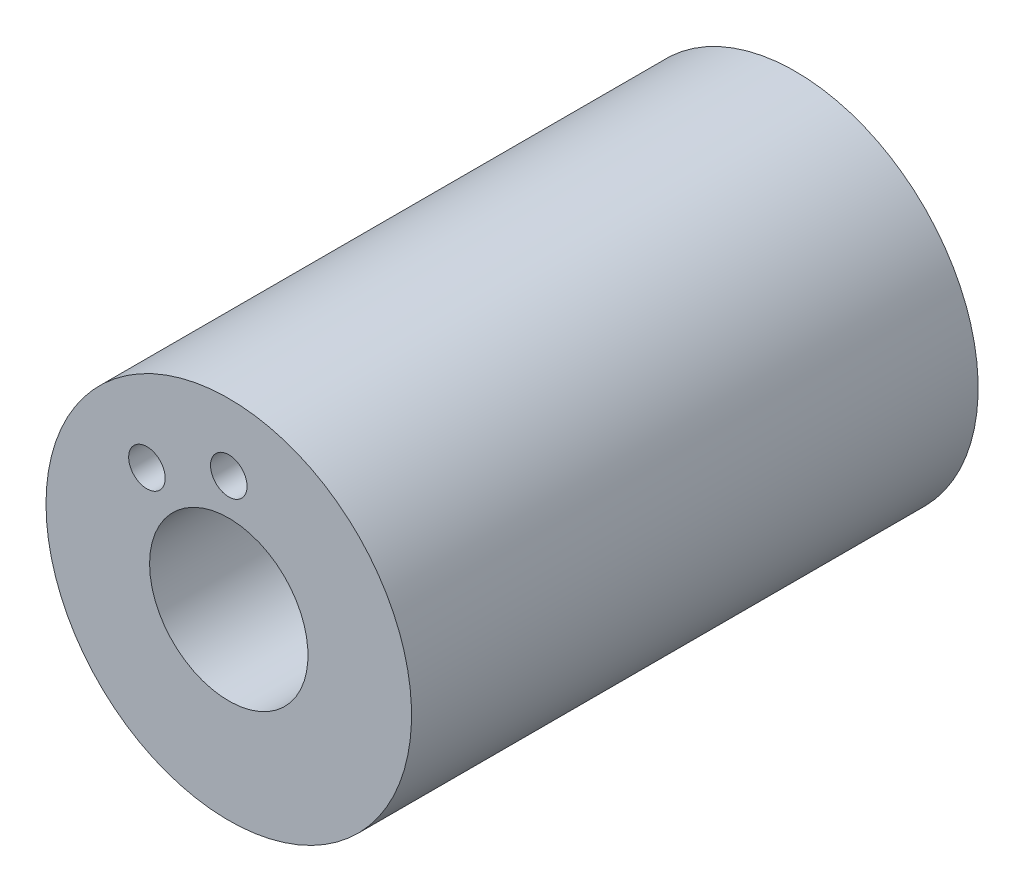
ISO-10303-21;
HEADER;
FILE_DESCRIPTION(('STEP AP214'),'2;1');
FILE_NAME('part.step','',(''),(''),'','','');
FILE_SCHEMA(('AUTOMOTIVE_DESIGN { 1 0 10303 214 1 1 1 1 }'));
ENDSEC;
DATA;
#1=APPLICATION_CONTEXT('core data for automotive mechanical design processes');
#2=APPLICATION_PROTOCOL_DEFINITION('international standard','automotive_design',2000,#1);
#3=PRODUCT_CONTEXT('',#1,'mechanical');
#4=PRODUCT('Part','Part','',(#3));
#5=PRODUCT_RELATED_PRODUCT_CATEGORY('part','',(#4));
#6=PRODUCT_DEFINITION_FORMATION('','',#4);
#7=PRODUCT_DEFINITION_CONTEXT('part definition',#1,'design');
#8=PRODUCT_DEFINITION('design','',#6,#7);
#9=PRODUCT_DEFINITION_SHAPE('','',#8);
#10=(LENGTH_UNIT() NAMED_UNIT(*) SI_UNIT(.MILLI.,.METRE.));
#11=(NAMED_UNIT(*) PLANE_ANGLE_UNIT() SI_UNIT($,.RADIAN.));
#12=(NAMED_UNIT(*) SI_UNIT($,.STERADIAN.) SOLID_ANGLE_UNIT());
#13=UNCERTAINTY_MEASURE_WITH_UNIT(LENGTH_MEASURE(1.E-05),#10,'distance_accuracy_value','');
#14=(GEOMETRIC_REPRESENTATION_CONTEXT(3) GLOBAL_UNCERTAINTY_ASSIGNED_CONTEXT((#13)) GLOBAL_UNIT_ASSIGNED_CONTEXT((#10,
#11,#12)) REPRESENTATION_CONTEXT('',''));
#15=CARTESIAN_POINT('',(0.,0.,0.));
#16=DIRECTION('',(0.,0.,1.));
#17=DIRECTION('',(1.,0.,0.));
#18=AXIS2_PLACEMENT_3D('',#15,#16,#17);
#19=CARTESIAN_POINT('',(0.,0.,23.25));
#20=DIRECTION('',(0.,0.,1.));
#21=DIRECTION('',(1.,0.,0.));
#22=AXIS2_PLACEMENT_3D('',#19,#20,#21);
#23=PLANE('',#22);
#24=CARTESIAN_POINT('',(0.,9.5,23.25));
#25=DIRECTION('',(0.,0.,1.));
#26=DIRECTION('',(1.,0.,0.));
#27=AXIS2_PLACEMENT_3D('',#24,#25,#26);
#28=CIRCLE('',#27,1.5);
#29=CARTESIAN_POINT('',(-1.5,9.5,23.25));
#30=VERTEX_POINT('',#29);
#31=EDGE_CURVE('E47',#30,#30,#28,.T.);
#32=ORIENTED_EDGE('',*,*,#31,.F.);
#33=EDGE_LOOP('',(#32));
#34=FACE_BOUND('',#33,.T.);
#35=CARTESIAN_POINT('',(0.,0.,23.25));
#36=DIRECTION('',(0.,0.,1.));
#37=DIRECTION('',(1.,0.,0.));
#38=AXIS2_PLACEMENT_3D('',#35,#36,#37);
#39=CIRCLE('',#38,15.);
#40=CARTESIAN_POINT('',(-15.,0.,23.25));
#41=VERTEX_POINT('',#40);
#42=EDGE_CURVE('E10',#41,#41,#39,.T.);
#43=ORIENTED_EDGE('',*,*,#42,.T.);
#44=EDGE_LOOP('',(#43));
#45=FACE_BOUND('',#44,.T.);
#46=CARTESIAN_POINT('',(0.,0.,23.25));
#47=DIRECTION('',(0.,0.,1.));
#48=DIRECTION('',(1.,0.,0.));
#49=AXIS2_PLACEMENT_3D('',#46,#47,#48);
#50=CIRCLE('',#49,6.5);
#51=CARTESIAN_POINT('',(-6.5,0.,23.25));
#52=VERTEX_POINT('',#51);
#53=EDGE_CURVE('E42',#52,#52,#50,.T.);
#54=ORIENTED_EDGE('',*,*,#53,.F.);
#55=EDGE_LOOP('',(#54));
#56=FACE_BOUND('',#55,.T.);
#57=CARTESIAN_POINT('',(-6.71751442127221,6.71751442127219,23.25));
#58=DIRECTION('',(0.,0.,1.));
#59=DIRECTION('',(1.,0.,0.));
#60=AXIS2_PLACEMENT_3D('',#57,#58,#59);
#61=CIRCLE('',#60,1.5);
#62=CARTESIAN_POINT('',(-8.21751442127221,6.71751442127219,23.25));
#63=VERTEX_POINT('',#62);
#64=EDGE_CURVE('E53',#63,#63,#61,.T.);
#65=ORIENTED_EDGE('',*,*,#64,.F.);
#66=EDGE_LOOP('',(#65));
#67=FACE_BOUND('',#66,.T.);
#68=ADVANCED_FACE('F31',(#34,#45,#56,#67),#23,.T.);
#69=CARTESIAN_POINT('',(0.,0.,-23.25));
#70=DIRECTION('',(0.,0.,1.));
#71=DIRECTION('',(1.,0.,0.));
#72=AXIS2_PLACEMENT_3D('',#69,#70,#71);
#73=PLANE('',#72);
#74=CARTESIAN_POINT('',(0.,0.,-23.25));
#75=DIRECTION('',(0.,0.,1.));
#76=DIRECTION('',(1.,0.,0.));
#77=AXIS2_PLACEMENT_3D('',#74,#75,#76);
#78=CIRCLE('',#77,15.);
#79=CARTESIAN_POINT('',(-15.,0.,-23.25));
#80=VERTEX_POINT('',#79);
#81=EDGE_CURVE('E35',#80,#80,#78,.T.);
#82=ORIENTED_EDGE('',*,*,#81,.F.);
#83=EDGE_LOOP('',(#82));
#84=FACE_BOUND('',#83,.T.);
#85=CARTESIAN_POINT('',(0.,0.,-23.25));
#86=DIRECTION('',(0.,0.,1.));
#87=DIRECTION('',(1.,0.,0.));
#88=AXIS2_PLACEMENT_3D('',#85,#86,#87);
#89=CIRCLE('',#88,6.5);
#90=CARTESIAN_POINT('',(-6.5,0.,-23.25));
#91=VERTEX_POINT('',#90);
#92=EDGE_CURVE('E44',#91,#91,#89,.T.);
#93=ORIENTED_EDGE('',*,*,#92,.T.);
#94=EDGE_LOOP('',(#93));
#95=FACE_BOUND('',#94,.T.);
#96=CARTESIAN_POINT('',(0.,9.5,-23.25));
#97=DIRECTION('',(0.,0.,1.));
#98=DIRECTION('',(1.,0.,0.));
#99=AXIS2_PLACEMENT_3D('',#96,#97,#98);
#100=CIRCLE('',#99,1.5);
#101=CARTESIAN_POINT('',(-1.5,9.5,-23.25));
#102=VERTEX_POINT('',#101);
#103=EDGE_CURVE('E50',#102,#102,#100,.T.);
#104=ORIENTED_EDGE('',*,*,#103,.T.);
#105=EDGE_LOOP('',(#104));
#106=FACE_BOUND('',#105,.T.);
#107=CARTESIAN_POINT('',(-6.71751442127221,6.71751442127219,-23.25));
#108=DIRECTION('',(0.,0.,1.));
#109=DIRECTION('',(1.,0.,0.));
#110=AXIS2_PLACEMENT_3D('',#107,#108,#109);
#111=CIRCLE('',#110,1.5);
#112=CARTESIAN_POINT('',(-8.21751442127221,6.71751442127219,-23.25));
#113=VERTEX_POINT('',#112);
#114=EDGE_CURVE('E56',#113,#113,#111,.T.);
#115=ORIENTED_EDGE('',*,*,#114,.T.);
#116=EDGE_LOOP('',(#115));
#117=FACE_BOUND('',#116,.T.);
#118=ADVANCED_FACE('F66',(#84,#95,#106,#117),#73,.F.);
#119=CARTESIAN_POINT('',(0.,0.,23.25));
#120=DIRECTION('',(0.,0.,-1.));
#121=DIRECTION('',(-1.,0.,0.));
#122=AXIS2_PLACEMENT_3D('',#119,#120,#121);
#123=CYLINDRICAL_SURFACE('',#122,15.);
#124=CARTESIAN_POINT('',(-15.,0.,23.25));
#125=CARTESIAN_POINT('',(-15.,0.,22.765625));
#126=CARTESIAN_POINT('',(-15.,0.,22.28125));
#127=CARTESIAN_POINT('',(-15.,0.,21.3125));
#128=CARTESIAN_POINT('',(-15.,0.,20.828125));
#129=CARTESIAN_POINT('',(-15.,0.,19.859375));
#130=CARTESIAN_POINT('',(-15.,0.,19.375));
#131=CARTESIAN_POINT('',(-15.,0.,18.40625));
#132=CARTESIAN_POINT('',(-15.,0.,17.921875));
#133=CARTESIAN_POINT('',(-15.,0.,16.953125));
#134=CARTESIAN_POINT('',(-15.,0.,16.46875));
#135=CARTESIAN_POINT('',(-15.,0.,15.5));
#136=CARTESIAN_POINT('',(-15.,0.,15.015625));
#137=CARTESIAN_POINT('',(-15.,0.,14.046875));
#138=CARTESIAN_POINT('',(-15.,0.,13.5625));
#139=CARTESIAN_POINT('',(-15.,0.,12.59375));
#140=CARTESIAN_POINT('',(-15.,0.,12.109375));
#141=CARTESIAN_POINT('',(-15.,0.,11.140625));
#142=CARTESIAN_POINT('',(-15.,0.,10.65625));
#143=CARTESIAN_POINT('',(-15.,0.,9.6875));
#144=CARTESIAN_POINT('',(-15.,0.,9.203125));
#145=CARTESIAN_POINT('',(-15.,0.,8.234375));
#146=CARTESIAN_POINT('',(-15.,0.,7.75));
#147=CARTESIAN_POINT('',(-15.,0.,6.78125));
#148=CARTESIAN_POINT('',(-15.,0.,6.296875));
#149=CARTESIAN_POINT('',(-15.,0.,5.328125));
#150=CARTESIAN_POINT('',(-15.,0.,4.84375));
#151=CARTESIAN_POINT('',(-15.,0.,3.875));
#152=CARTESIAN_POINT('',(-15.,0.,3.390625));
#153=CARTESIAN_POINT('',(-15.,0.,2.421875));
#154=CARTESIAN_POINT('',(-15.,0.,1.9375));
#155=CARTESIAN_POINT('',(-15.,0.,0.968749999999996));
#156=CARTESIAN_POINT('',(-15.,0.,0.484374999999996));
#157=CARTESIAN_POINT('',(-15.,0.,-0.484375000000003));
#158=CARTESIAN_POINT('',(-15.,0.,-0.968750000000003));
#159=CARTESIAN_POINT('',(-15.,0.,-1.9375));
#160=CARTESIAN_POINT('',(-15.,0.,-2.421875));
#161=CARTESIAN_POINT('',(-15.,0.,-3.390625));
#162=CARTESIAN_POINT('',(-15.,0.,-3.875));
#163=CARTESIAN_POINT('',(-15.,0.,-4.84375000000001));
#164=CARTESIAN_POINT('',(-15.,0.,-5.32812500000001));
#165=CARTESIAN_POINT('',(-15.,0.,-6.296875));
#166=CARTESIAN_POINT('',(-15.,0.,-6.78125000000001));
#167=CARTESIAN_POINT('',(-15.,0.,-7.75));
#168=CARTESIAN_POINT('',(-15.,0.,-8.234375));
#169=CARTESIAN_POINT('',(-15.,0.,-9.20312500000001));
#170=CARTESIAN_POINT('',(-15.,0.,-9.6875));
#171=CARTESIAN_POINT('',(-15.,0.,-10.65625));
#172=CARTESIAN_POINT('',(-15.,0.,-11.140625));
#173=CARTESIAN_POINT('',(-15.,0.,-12.109375));
#174=CARTESIAN_POINT('',(-15.,0.,-12.59375));
#175=CARTESIAN_POINT('',(-15.,0.,-13.5625));
#176=CARTESIAN_POINT('',(-15.,0.,-14.046875));
#177=CARTESIAN_POINT('',(-15.,0.,-15.015625));
#178=CARTESIAN_POINT('',(-15.,0.,-15.5));
#179=CARTESIAN_POINT('',(-15.,0.,-16.46875));
#180=CARTESIAN_POINT('',(-15.,0.,-16.953125));
#181=CARTESIAN_POINT('',(-15.,0.,-17.921875));
#182=CARTESIAN_POINT('',(-15.,0.,-18.40625));
#183=CARTESIAN_POINT('',(-15.,0.,-19.375));
#184=CARTESIAN_POINT('',(-15.,0.,-19.859375));
#185=CARTESIAN_POINT('',(-15.,0.,-20.828125));
#186=CARTESIAN_POINT('',(-15.,0.,-21.3125));
#187=CARTESIAN_POINT('',(-15.,0.,-22.28125));
#188=CARTESIAN_POINT('',(-15.,0.,-22.765625));
#189=CARTESIAN_POINT('',(-15.,0.,-23.25));
#190=B_SPLINE_CURVE_WITH_KNOTS('',3,(#124,#125,#126,#127,#128,#129,#130,#131,#132,#133,#134,
#135,#136,#137,#138,#139,#140,#141,#142,#143,#144,#145,#146,#147,#148,#149,#150,#151,#152,#153,
#154,#155,#156,#157,#158,#159,#160,#161,#162,#163,#164,#165,#166,#167,#168,#169,#170,#171,#172,
#173,#174,#175,#176,#177,#178,#179,#180,#181,#182,#183,#184,#185,#186,#187,#188,#189),
.UNSPECIFIED.,.F.,.F.,(4,2,2,2,2,2,2,2,2,2,2,2,2,2,2,2,2,2,2,2,2,2,2,2,2,2,2,2,2,2,2,2,4),(0.,
1.453125,2.90625,4.359375,5.8125,7.265625,8.71875,10.171875,11.625,13.078125,14.53125,15.984375,
17.4375,18.890625,20.34375,21.796875,23.25,24.703125,26.15625,27.609375,29.0625,30.515625,
31.96875,33.421875,34.875,36.328125,37.78125,39.234375,40.6875,42.140625,43.59375,45.046875,
46.5),.UNSPECIFIED.);
#191=EDGE_CURVE('BSEAM33',#41,#80,#190,.T.);
#192=ORIENTED_EDGE('',*,*,#42,.F.);
#193=ORIENTED_EDGE('',*,*,#81,.T.);
#194=ORIENTED_EDGE('',*,*,#191,.T.);
#195=ORIENTED_EDGE('',*,*,#191,.F.);
#196=EDGE_LOOP('',(#192,#194,#193,#195));
#197=FACE_BOUND('',#196,.T.);
#198=ADVANCED_FACE('F33',(#197),#123,.T.);
#199=CARTESIAN_POINT('',(0.,0.,23.25));
#200=DIRECTION('',(0.,0.,-1.));
#201=DIRECTION('',(-1.,0.,0.));
#202=AXIS2_PLACEMENT_3D('',#199,#200,#201);
#203=CYLINDRICAL_SURFACE('',#202,6.5);
#204=CARTESIAN_POINT('',(-6.5,0.,23.25));
#205=CARTESIAN_POINT('',(-6.5,0.,22.765625));
#206=CARTESIAN_POINT('',(-6.5,0.,22.28125));
#207=CARTESIAN_POINT('',(-6.5,0.,21.3125));
#208=CARTESIAN_POINT('',(-6.5,0.,20.828125));
#209=CARTESIAN_POINT('',(-6.5,0.,19.859375));
#210=CARTESIAN_POINT('',(-6.5,0.,19.375));
#211=CARTESIAN_POINT('',(-6.5,0.,18.40625));
#212=CARTESIAN_POINT('',(-6.5,0.,17.921875));
#213=CARTESIAN_POINT('',(-6.5,0.,16.953125));
#214=CARTESIAN_POINT('',(-6.5,0.,16.46875));
#215=CARTESIAN_POINT('',(-6.5,0.,15.5));
#216=CARTESIAN_POINT('',(-6.5,0.,15.015625));
#217=CARTESIAN_POINT('',(-6.5,0.,14.046875));
#218=CARTESIAN_POINT('',(-6.5,0.,13.5625));
#219=CARTESIAN_POINT('',(-6.5,0.,12.59375));
#220=CARTESIAN_POINT('',(-6.5,0.,12.109375));
#221=CARTESIAN_POINT('',(-6.5,0.,11.140625));
#222=CARTESIAN_POINT('',(-6.5,0.,10.65625));
#223=CARTESIAN_POINT('',(-6.5,0.,9.6875));
#224=CARTESIAN_POINT('',(-6.5,0.,9.203125));
#225=CARTESIAN_POINT('',(-6.5,0.,8.23437499999999));
#226=CARTESIAN_POINT('',(-6.5,0.,7.74999999999999));
#227=CARTESIAN_POINT('',(-6.5,0.,6.78124999999999));
#228=CARTESIAN_POINT('',(-6.5,0.,6.29687499999999));
#229=CARTESIAN_POINT('',(-6.5,0.,5.328125));
#230=CARTESIAN_POINT('',(-6.5,0.,4.84374999999999));
#231=CARTESIAN_POINT('',(-6.5,0.,3.87499999999999));
#232=CARTESIAN_POINT('',(-6.5,0.,3.39062499999999));
#233=CARTESIAN_POINT('',(-6.5,0.,2.42187499999999));
#234=CARTESIAN_POINT('',(-6.5,0.,1.93749999999999));
#235=CARTESIAN_POINT('',(-6.5,0.,0.968749999999993));
#236=CARTESIAN_POINT('',(-6.5,0.,0.484374999999993));
#237=CARTESIAN_POINT('',(-6.5,0.,-0.484375000000007));
#238=CARTESIAN_POINT('',(-6.5,0.,-0.968750000000007));
#239=CARTESIAN_POINT('',(-6.5,0.,-1.93750000000001));
#240=CARTESIAN_POINT('',(-6.5,0.,-2.42187500000001));
#241=CARTESIAN_POINT('',(-6.5,0.,-3.39062500000001));
#242=CARTESIAN_POINT('',(-6.5,0.,-3.87500000000001));
#243=CARTESIAN_POINT('',(-6.5,0.,-4.84375000000001));
#244=CARTESIAN_POINT('',(-6.5,0.,-5.32812500000001));
#245=CARTESIAN_POINT('',(-6.5,0.,-6.29687500000001));
#246=CARTESIAN_POINT('',(-6.5,0.,-6.78125000000001));
#247=CARTESIAN_POINT('',(-6.5,0.,-7.75000000000001));
#248=CARTESIAN_POINT('',(-6.5,0.,-8.23437500000001));
#249=CARTESIAN_POINT('',(-6.5,0.,-9.20312500000001));
#250=CARTESIAN_POINT('',(-6.5,0.,-9.6875));
#251=CARTESIAN_POINT('',(-6.5,0.,-10.65625));
#252=CARTESIAN_POINT('',(-6.5,0.,-11.140625));
#253=CARTESIAN_POINT('',(-6.5,0.,-12.109375));
#254=CARTESIAN_POINT('',(-6.5,0.,-12.59375));
#255=CARTESIAN_POINT('',(-6.5,0.,-13.5625));
#256=CARTESIAN_POINT('',(-6.5,0.,-14.046875));
#257=CARTESIAN_POINT('',(-6.5,0.,-15.015625));
#258=CARTESIAN_POINT('',(-6.5,0.,-15.5));
#259=CARTESIAN_POINT('',(-6.5,0.,-16.46875));
#260=CARTESIAN_POINT('',(-6.5,0.,-16.953125));
#261=CARTESIAN_POINT('',(-6.5,0.,-17.921875));
#262=CARTESIAN_POINT('',(-6.5,0.,-18.40625));
#263=CARTESIAN_POINT('',(-6.5,0.,-19.375));
#264=CARTESIAN_POINT('',(-6.5,0.,-19.859375));
#265=CARTESIAN_POINT('',(-6.5,0.,-20.828125));
#266=CARTESIAN_POINT('',(-6.5,0.,-21.3125));
#267=CARTESIAN_POINT('',(-6.5,0.,-22.28125));
#268=CARTESIAN_POINT('',(-6.5,0.,-22.765625));
#269=CARTESIAN_POINT('',(-6.5,0.,-23.25));
#270=B_SPLINE_CURVE_WITH_KNOTS('',3,(#204,#205,#206,#207,#208,#209,#210,#211,#212,#213,#214,
#215,#216,#217,#218,#219,#220,#221,#222,#223,#224,#225,#226,#227,#228,#229,#230,#231,#232,#233,
#234,#235,#236,#237,#238,#239,#240,#241,#242,#243,#244,#245,#246,#247,#248,#249,#250,#251,#252,
#253,#254,#255,#256,#257,#258,#259,#260,#261,#262,#263,#264,#265,#266,#267,#268,#269),
.UNSPECIFIED.,.F.,.F.,(4,2,2,2,2,2,2,2,2,2,2,2,2,2,2,2,2,2,2,2,2,2,2,2,2,2,2,2,2,2,2,2,4),(0.,
1.453125,2.90625,4.359375,5.8125,7.265625,8.71875,10.171875,11.625,13.078125,14.53125,15.984375,
17.4375,18.890625,20.34375,21.796875,23.25,24.703125,26.15625,27.609375,29.0625,30.515625,
31.96875,33.421875,34.875,36.328125,37.78125,39.234375,40.6875,42.140625,43.59375,45.046875,
46.5),.UNSPECIFIED.);
#271=EDGE_CURVE('BSEAM75',#52,#91,#270,.T.);
#272=ORIENTED_EDGE('',*,*,#53,.T.);
#273=ORIENTED_EDGE('',*,*,#92,.F.);
#274=ORIENTED_EDGE('',*,*,#271,.T.);
#275=ORIENTED_EDGE('',*,*,#271,.F.);
#276=EDGE_LOOP('',(#272,#274,#273,#275));
#277=FACE_BOUND('',#276,.T.);
#278=ADVANCED_FACE('F75',(#277),#203,.F.);
#279=CARTESIAN_POINT('',(0.,9.5,23.25));
#280=DIRECTION('',(0.,0.,-1.));
#281=DIRECTION('',(-1.,0.,0.));
#282=AXIS2_PLACEMENT_3D('',#279,#280,#281);
#283=CYLINDRICAL_SURFACE('',#282,1.5);
#284=CARTESIAN_POINT('',(-1.5,9.5,23.25));
#285=CARTESIAN_POINT('',(-1.5,9.5,22.765625));
#286=CARTESIAN_POINT('',(-1.5,9.5,22.28125));
#287=CARTESIAN_POINT('',(-1.5,9.5,21.3125));
#288=CARTESIAN_POINT('',(-1.5,9.5,20.828125));
#289=CARTESIAN_POINT('',(-1.5,9.5,19.859375));
#290=CARTESIAN_POINT('',(-1.5,9.5,19.375));
#291=CARTESIAN_POINT('',(-1.5,9.5,18.40625));
#292=CARTESIAN_POINT('',(-1.5,9.5,17.921875));
#293=CARTESIAN_POINT('',(-1.5,9.5,16.953125));
#294=CARTESIAN_POINT('',(-1.5,9.5,16.46875));
#295=CARTESIAN_POINT('',(-1.5,9.5,15.5));
#296=CARTESIAN_POINT('',(-1.5,9.5,15.015625));
#297=CARTESIAN_POINT('',(-1.5,9.5,14.046875));
#298=CARTESIAN_POINT('',(-1.5,9.5,13.5625));
#299=CARTESIAN_POINT('',(-1.5,9.5,12.59375));
#300=CARTESIAN_POINT('',(-1.5,9.5,12.109375));
#301=CARTESIAN_POINT('',(-1.5,9.5,11.140625));
#302=CARTESIAN_POINT('',(-1.5,9.5,10.65625));
#303=CARTESIAN_POINT('',(-1.5,9.5,9.6875));
#304=CARTESIAN_POINT('',(-1.5,9.5,9.203125));
#305=CARTESIAN_POINT('',(-1.5,9.5,8.23437499999999));
#306=CARTESIAN_POINT('',(-1.5,9.5,7.74999999999999));
#307=CARTESIAN_POINT('',(-1.5,9.5,6.78124999999999));
#308=CARTESIAN_POINT('',(-1.5,9.5,6.29687499999999));
#309=CARTESIAN_POINT('',(-1.5,9.5,5.328125));
#310=CARTESIAN_POINT('',(-1.5,9.5,4.84374999999999));
#311=CARTESIAN_POINT('',(-1.5,9.5,3.87499999999999));
#312=CARTESIAN_POINT('',(-1.5,9.5,3.39062499999999));
#313=CARTESIAN_POINT('',(-1.5,9.5,2.42187499999999));
#314=CARTESIAN_POINT('',(-1.5,9.5,1.93749999999999));
#315=CARTESIAN_POINT('',(-1.5,9.5,0.968749999999993));
#316=CARTESIAN_POINT('',(-1.5,9.5,0.484374999999993));
#317=CARTESIAN_POINT('',(-1.5,9.5,-0.484375000000007));
#318=CARTESIAN_POINT('',(-1.5,9.5,-0.968750000000007));
#319=CARTESIAN_POINT('',(-1.5,9.5,-1.93750000000001));
#320=CARTESIAN_POINT('',(-1.5,9.5,-2.42187500000001));
#321=CARTESIAN_POINT('',(-1.5,9.5,-3.39062500000001));
#322=CARTESIAN_POINT('',(-1.5,9.5,-3.87500000000001));
#323=CARTESIAN_POINT('',(-1.5,9.5,-4.84375000000001));
#324=CARTESIAN_POINT('',(-1.5,9.5,-5.32812500000001));
#325=CARTESIAN_POINT('',(-1.5,9.5,-6.29687500000001));
#326=CARTESIAN_POINT('',(-1.5,9.5,-6.78125000000001));
#327=CARTESIAN_POINT('',(-1.5,9.5,-7.75000000000001));
#328=CARTESIAN_POINT('',(-1.5,9.5,-8.23437500000001));
#329=CARTESIAN_POINT('',(-1.5,9.5,-9.20312500000001));
#330=CARTESIAN_POINT('',(-1.5,9.5,-9.6875));
#331=CARTESIAN_POINT('',(-1.5,9.5,-10.65625));
#332=CARTESIAN_POINT('',(-1.5,9.5,-11.140625));
#333=CARTESIAN_POINT('',(-1.5,9.5,-12.109375));
#334=CARTESIAN_POINT('',(-1.5,9.5,-12.59375));
#335=CARTESIAN_POINT('',(-1.5,9.5,-13.5625));
#336=CARTESIAN_POINT('',(-1.5,9.5,-14.046875));
#337=CARTESIAN_POINT('',(-1.5,9.5,-15.015625));
#338=CARTESIAN_POINT('',(-1.5,9.5,-15.5));
#339=CARTESIAN_POINT('',(-1.5,9.5,-16.46875));
#340=CARTESIAN_POINT('',(-1.5,9.5,-16.953125));
#341=CARTESIAN_POINT('',(-1.5,9.5,-17.921875));
#342=CARTESIAN_POINT('',(-1.5,9.5,-18.40625));
#343=CARTESIAN_POINT('',(-1.5,9.5,-19.375));
#344=CARTESIAN_POINT('',(-1.5,9.5,-19.859375));
#345=CARTESIAN_POINT('',(-1.5,9.5,-20.828125));
#346=CARTESIAN_POINT('',(-1.5,9.5,-21.3125));
#347=CARTESIAN_POINT('',(-1.5,9.5,-22.28125));
#348=CARTESIAN_POINT('',(-1.5,9.5,-22.765625));
#349=CARTESIAN_POINT('',(-1.5,9.5,-23.25));
#350=B_SPLINE_CURVE_WITH_KNOTS('',3,(#284,#285,#286,#287,#288,#289,#290,#291,#292,#293,#294,
#295,#296,#297,#298,#299,#300,#301,#302,#303,#304,#305,#306,#307,#308,#309,#310,#311,#312,#313,
#314,#315,#316,#317,#318,#319,#320,#321,#322,#323,#324,#325,#326,#327,#328,#329,#330,#331,#332,
#333,#334,#335,#336,#337,#338,#339,#340,#341,#342,#343,#344,#345,#346,#347,#348,#349),
.UNSPECIFIED.,.F.,.F.,(4,2,2,2,2,2,2,2,2,2,2,2,2,2,2,2,2,2,2,2,2,2,2,2,2,2,2,2,2,2,2,2,4),(0.,
1.453125,2.90625,4.359375,5.8125,7.265625,8.71875,10.171875,11.625,13.078125,14.53125,15.984375,
17.4375,18.890625,20.34375,21.796875,23.25,24.703125,26.15625,27.609375,29.0625,30.515625,
31.96875,33.421875,34.875,36.328125,37.78125,39.234375,40.6875,42.140625,43.59375,45.046875,
46.5),.UNSPECIFIED.);
#351=EDGE_CURVE('BSEAM78',#30,#102,#350,.T.);
#352=ORIENTED_EDGE('',*,*,#31,.T.);
#353=ORIENTED_EDGE('',*,*,#103,.F.);
#354=ORIENTED_EDGE('',*,*,#351,.T.);
#355=ORIENTED_EDGE('',*,*,#351,.F.);
#356=EDGE_LOOP('',(#352,#354,#353,#355));
#357=FACE_BOUND('',#356,.T.);
#358=ADVANCED_FACE('F78',(#357),#283,.F.);
#359=CARTESIAN_POINT('',(-6.71751442127221,6.71751442127219,23.25));
#360=DIRECTION('',(0.,0.,-1.));
#361=DIRECTION('',(-1.,0.,0.));
#362=AXIS2_PLACEMENT_3D('',#359,#360,#361);
#363=CYLINDRICAL_SURFACE('',#362,1.5);
#364=CARTESIAN_POINT('',(-8.21751442127221,6.71751442127219,23.25));
#365=CARTESIAN_POINT('',(-8.21751442127221,6.71751442127219,22.765625));
#366=CARTESIAN_POINT('',(-8.21751442127221,6.71751442127219,22.28125));
#367=CARTESIAN_POINT('',(-8.21751442127221,6.71751442127219,21.3125));
#368=CARTESIAN_POINT('',(-8.21751442127221,6.71751442127219,20.828125));
#369=CARTESIAN_POINT('',(-8.21751442127221,6.71751442127219,19.859375));
#370=CARTESIAN_POINT('',(-8.21751442127221,6.71751442127219,19.375));
#371=CARTESIAN_POINT('',(-8.21751442127221,6.71751442127219,18.40625));
#372=CARTESIAN_POINT('',(-8.21751442127221,6.71751442127219,17.921875));
#373=CARTESIAN_POINT('',(-8.21751442127221,6.71751442127219,16.953125));
#374=CARTESIAN_POINT('',(-8.21751442127221,6.71751442127219,16.46875));
#375=CARTESIAN_POINT('',(-8.21751442127221,6.71751442127219,15.5));
#376=CARTESIAN_POINT('',(-8.21751442127221,6.71751442127219,15.015625));
#377=CARTESIAN_POINT('',(-8.21751442127221,6.71751442127219,14.046875));
#378=CARTESIAN_POINT('',(-8.21751442127221,6.71751442127219,13.5625));
#379=CARTESIAN_POINT('',(-8.21751442127221,6.71751442127219,12.59375));
#380=CARTESIAN_POINT('',(-8.21751442127221,6.71751442127219,12.109375));
#381=CARTESIAN_POINT('',(-8.21751442127221,6.71751442127219,11.140625));
#382=CARTESIAN_POINT('',(-8.21751442127221,6.71751442127219,10.65625));
#383=CARTESIAN_POINT('',(-8.21751442127221,6.71751442127219,9.6875));
#384=CARTESIAN_POINT('',(-8.21751442127221,6.71751442127219,9.203125));
#385=CARTESIAN_POINT('',(-8.21751442127221,6.71751442127219,8.23437499999999));
#386=CARTESIAN_POINT('',(-8.21751442127221,6.71751442127219,7.74999999999999));
#387=CARTESIAN_POINT('',(-8.21751442127221,6.71751442127219,6.78124999999999));
#388=CARTESIAN_POINT('',(-8.21751442127221,6.71751442127219,6.29687499999999));
#389=CARTESIAN_POINT('',(-8.21751442127221,6.71751442127219,5.328125));
#390=CARTESIAN_POINT('',(-8.21751442127221,6.71751442127219,4.84374999999999));
#391=CARTESIAN_POINT('',(-8.21751442127221,6.71751442127219,3.87499999999999));
#392=CARTESIAN_POINT('',(-8.21751442127221,6.71751442127219,3.39062499999999));
#393=CARTESIAN_POINT('',(-8.21751442127221,6.71751442127219,2.42187499999999));
#394=CARTESIAN_POINT('',(-8.21751442127221,6.71751442127219,1.93749999999999));
#395=CARTESIAN_POINT('',(-8.21751442127221,6.71751442127219,0.968749999999993));
#396=CARTESIAN_POINT('',(-8.21751442127221,6.71751442127219,0.484374999999993));
#397=CARTESIAN_POINT('',(-8.21751442127221,6.71751442127219,-0.484375000000007));
#398=CARTESIAN_POINT('',(-8.21751442127221,6.71751442127219,-0.968750000000007));
#399=CARTESIAN_POINT('',(-8.21751442127221,6.71751442127219,-1.93750000000001));
#400=CARTESIAN_POINT('',(-8.21751442127221,6.71751442127219,-2.42187500000001));
#401=CARTESIAN_POINT('',(-8.21751442127221,6.71751442127219,-3.39062500000001));
#402=CARTESIAN_POINT('',(-8.21751442127221,6.71751442127219,-3.87500000000001));
#403=CARTESIAN_POINT('',(-8.21751442127221,6.71751442127219,-4.84375000000001));
#404=CARTESIAN_POINT('',(-8.21751442127221,6.71751442127219,-5.32812500000001));
#405=CARTESIAN_POINT('',(-8.21751442127221,6.71751442127219,-6.29687500000001));
#406=CARTESIAN_POINT('',(-8.21751442127221,6.71751442127219,-6.78125000000001));
#407=CARTESIAN_POINT('',(-8.21751442127221,6.71751442127219,-7.75000000000001));
#408=CARTESIAN_POINT('',(-8.21751442127221,6.71751442127219,-8.23437500000001));
#409=CARTESIAN_POINT('',(-8.21751442127221,6.71751442127219,-9.20312500000001));
#410=CARTESIAN_POINT('',(-8.21751442127221,6.71751442127219,-9.6875));
#411=CARTESIAN_POINT('',(-8.21751442127221,6.71751442127219,-10.65625));
#412=CARTESIAN_POINT('',(-8.21751442127221,6.71751442127219,-11.140625));
#413=CARTESIAN_POINT('',(-8.21751442127221,6.71751442127219,-12.109375));
#414=CARTESIAN_POINT('',(-8.21751442127221,6.71751442127219,-12.59375));
#415=CARTESIAN_POINT('',(-8.21751442127221,6.71751442127219,-13.5625));
#416=CARTESIAN_POINT('',(-8.21751442127221,6.71751442127219,-14.046875));
#417=CARTESIAN_POINT('',(-8.21751442127221,6.71751442127219,-15.015625));
#418=CARTESIAN_POINT('',(-8.21751442127221,6.71751442127219,-15.5));
#419=CARTESIAN_POINT('',(-8.21751442127221,6.71751442127219,-16.46875));
#420=CARTESIAN_POINT('',(-8.21751442127221,6.71751442127219,-16.953125));
#421=CARTESIAN_POINT('',(-8.21751442127221,6.71751442127219,-17.921875));
#422=CARTESIAN_POINT('',(-8.21751442127221,6.71751442127219,-18.40625));
#423=CARTESIAN_POINT('',(-8.21751442127221,6.71751442127219,-19.375));
#424=CARTESIAN_POINT('',(-8.21751442127221,6.71751442127219,-19.859375));
#425=CARTESIAN_POINT('',(-8.21751442127221,6.71751442127219,-20.828125));
#426=CARTESIAN_POINT('',(-8.21751442127221,6.71751442127219,-21.3125));
#427=CARTESIAN_POINT('',(-8.21751442127221,6.71751442127219,-22.28125));
#428=CARTESIAN_POINT('',(-8.21751442127221,6.71751442127219,-22.765625));
#429=CARTESIAN_POINT('',(-8.21751442127221,6.71751442127219,-23.25));
#430=B_SPLINE_CURVE_WITH_KNOTS('',3,(#364,#365,#366,#367,#368,#369,#370,#371,#372,#373,#374,
#375,#376,#377,#378,#379,#380,#381,#382,#383,#384,#385,#386,#387,#388,#389,#390,#391,#392,#393,
#394,#395,#396,#397,#398,#399,#400,#401,#402,#403,#404,#405,#406,#407,#408,#409,#410,#411,#412,
#413,#414,#415,#416,#417,#418,#419,#420,#421,#422,#423,#424,#425,#426,#427,#428,#429),
.UNSPECIFIED.,.F.,.F.,(4,2,2,2,2,2,2,2,2,2,2,2,2,2,2,2,2,2,2,2,2,2,2,2,2,2,2,2,2,2,2,2,4),(0.,
1.453125,2.90625,4.359375,5.8125,7.265625,8.71875,10.171875,11.625,13.078125,14.53125,15.984375,
17.4375,18.890625,20.34375,21.796875,23.25,24.703125,26.15625,27.609375,29.0625,30.515625,
31.96875,33.421875,34.875,36.328125,37.78125,39.234375,40.6875,42.140625,43.59375,45.046875,
46.5),.UNSPECIFIED.);
#431=EDGE_CURVE('BSEAM62',#63,#113,#430,.T.);
#432=ORIENTED_EDGE('',*,*,#64,.T.);
#433=ORIENTED_EDGE('',*,*,#114,.F.);
#434=ORIENTED_EDGE('',*,*,#431,.T.);
#435=ORIENTED_EDGE('',*,*,#431,.F.);
#436=EDGE_LOOP('',(#432,#434,#433,#435));
#437=FACE_BOUND('',#436,.T.);
#438=ADVANCED_FACE('F62',(#437),#363,.F.);
#439=CLOSED_SHELL('',(#68,#118,#198,#278,#358,#438));
#440=MANIFOLD_SOLID_BREP('B2',#439);
#441=ADVANCED_BREP_SHAPE_REPRESENTATION('',(#18,#440),#14);
#442=SHAPE_DEFINITION_REPRESENTATION(#9,#441);
ENDSEC;
END-ISO-10303-21;
